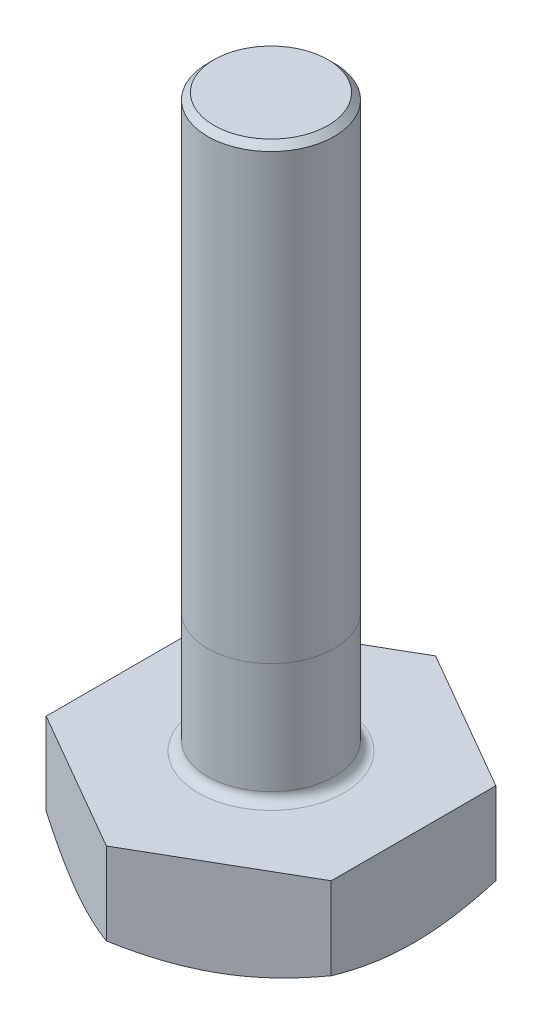
ISO-10303-21;
HEADER;
FILE_DESCRIPTION(('STEP AP214'),'2;1');
FILE_NAME('part.step','',(''),(''),'','','');
FILE_SCHEMA(('AUTOMOTIVE_DESIGN { 1 0 10303 214 1 1 1 1 }'));
ENDSEC;
DATA;
#1=APPLICATION_CONTEXT('core data for automotive mechanical design processes');
#2=APPLICATION_PROTOCOL_DEFINITION('international standard','automotive_design',2000,#1);
#3=PRODUCT_CONTEXT('',#1,'mechanical');
#4=PRODUCT('Part','Part','',(#3));
#5=PRODUCT_RELATED_PRODUCT_CATEGORY('part','',(#4));
#6=PRODUCT_DEFINITION_FORMATION('','',#4);
#7=PRODUCT_DEFINITION_CONTEXT('part definition',#1,'design');
#8=PRODUCT_DEFINITION('design','',#6,#7);
#9=PRODUCT_DEFINITION_SHAPE('','',#8);
#10=(LENGTH_UNIT() NAMED_UNIT(*) SI_UNIT(.MILLI.,.METRE.));
#11=(NAMED_UNIT(*) PLANE_ANGLE_UNIT() SI_UNIT($,.RADIAN.));
#12=(NAMED_UNIT(*) SI_UNIT($,.STERADIAN.) SOLID_ANGLE_UNIT());
#13=UNCERTAINTY_MEASURE_WITH_UNIT(LENGTH_MEASURE(1.E-05),#10,'distance_accuracy_value','');
#14=(GEOMETRIC_REPRESENTATION_CONTEXT(3) GLOBAL_UNCERTAINTY_ASSIGNED_CONTEXT((#13)) GLOBAL_UNIT_ASSIGNED_CONTEXT((#10,
#11,#12)) REPRESENTATION_CONTEXT('',''));
#15=CARTESIAN_POINT('',(0.,0.,0.));
#16=DIRECTION('',(0.,0.,1.));
#17=DIRECTION('',(1.,0.,0.));
#18=AXIS2_PLACEMENT_3D('',#15,#16,#17);
#19=CARTESIAN_POINT('',(0.,10.5,0.));
#20=DIRECTION('',(0.,-1.,0.));
#21=DIRECTION('',(0.,0.,-1.));
#22=AXIS2_PLACEMENT_3D('',#19,#20,#21);
#23=CYLINDRICAL_SURFACE('',#22,1.);
#24=CARTESIAN_POINT('',(0.,1.65,0.));
#25=DIRECTION('',(0.,1.,0.));
#26=DIRECTION('',(0.,0.,1.));
#27=AXIS2_PLACEMENT_3D('',#24,#25,#26);
#28=CIRCLE('',#27,1.);
#29=CARTESIAN_POINT('',(0.,1.65,1.));
#30=VERTEX_POINT('',#29);
#31=EDGE_CURVE('E242',#30,#30,#28,.T.);
#32=ORIENTED_EDGE('',*,*,#31,.T.);
#33=EDGE_LOOP('',(#32));
#34=FACE_BOUND('',#33,.T.);
#35=CARTESIAN_POINT('',(0.,3.4,0.));
#36=DIRECTION('',(0.,1.,0.));
#37=DIRECTION('',(0.,0.,1.));
#38=AXIS2_PLACEMENT_3D('',#35,#36,#37);
#39=CIRCLE('',#38,1.);
#40=CARTESIAN_POINT('',(0.,3.4,1.));
#41=VERTEX_POINT('',#40);
#42=EDGE_CURVE('E12',#41,#41,#39,.T.);
#43=ORIENTED_EDGE('',*,*,#42,.F.);
#44=EDGE_LOOP('',(#43));
#45=FACE_BOUND('',#44,.T.);
#46=ADVANCED_FACE('F43',(#34,#45),#23,.T.);
#47=CARTESIAN_POINT('',(-2.25,1.5,1.29903810567666));
#48=DIRECTION('',(0.5,0.,-0.866025403784439));
#49=DIRECTION('',(-0.866025403784439,0.,-0.5));
#50=AXIS2_PLACEMENT_3D('',#47,#48,#49);
#51=PLANE('',#50);
#52=DIRECTION('',(0.,-1.,0.));
#53=VECTOR('',#52,1.);
#54=CARTESIAN_POINT('',(-2.25,1.5,1.29903810567666));
#55=LINE('',#54,#53);
#56=CARTESIAN_POINT('',(-2.25,1.5,1.29903810567666));
#57=VERTEX_POINT('',#56);
#58=CARTESIAN_POINT('',(-2.25,0.200961894323341,1.29903810567666));
#59=VERTEX_POINT('',#58);
#60=EDGE_CURVE('E449',#57,#59,#55,.T.);
#61=ORIENTED_EDGE('',*,*,#60,.T.);
#62=CARTESIAN_POINT('',(-2.2502,0.201028565434255,1.29892263562282));
#63=CARTESIAN_POINT('',(-2.15132275118564,0.168055578047864,1.35600944184252));
#64=CARTESIAN_POINT('',(-2.05159200282091,0.138067535415598,1.41358901625738));
#65=CARTESIAN_POINT('',(-1.85040345977937,0.0857223882308779,1.52974527574028));
#66=CARTESIAN_POINT('',(-1.74894208949705,0.0633838027064785,1.58832402518513));
#67=CARTESIAN_POINT('',(-1.54727681019892,0.0286095576734186,1.7047555284741));
#68=CARTESIAN_POINT('',(-1.44710393502333,0.0159424738337181,1.76259036492223));
#69=CARTESIAN_POINT('',(-1.24628668739732,0.000818907417418712,1.87853225689702));
#70=CARTESIAN_POINT('',(-1.1456430451668,-0.00165009697600165,1.93663889083104));
#71=CARTESIAN_POINT('',(-0.957574835473435,0.00347837463602921,2.04522012232352));
#72=CARTESIAN_POINT('',(-0.870122156108742,0.00981663451512028,2.09571095029608));
#73=CARTESIAN_POINT('',(-0.695786567891226,0.029907657189889,2.19636364908279));
#74=CARTESIAN_POINT('',(-0.608904262311712,0.0436672872310835,2.24652517159694));
#75=CARTESIAN_POINT('',(-0.434209045898264,0.0780662653506653,2.34738550181938));
#76=CARTESIAN_POINT('',(-0.346418252564747,0.0988514715826553,2.39807153998286));
#77=CARTESIAN_POINT('',(-0.172146263122405,0.146026087362979,2.49868751999961));
#78=CARTESIAN_POINT('',(-0.0856628332489982,0.172404408014302,2.54861875151746));
#79=CARTESIAN_POINT('',(0.000199999999999285,0.201028565434254,2.59819168140715));
#80=B_SPLINE_CURVE_WITH_KNOTS('',3,(#62,#63,#64,#65,#66,#67,#68,#69,#70,#71,#72,#73,#74,#75,#76,
#77,#78,#79),.UNSPECIFIED.,.F.,.F.,(4,2,2,2,2,2,2,2,4),(0.,0.356658826016553,0.714175103224236,
1.06284241804968,1.41108149062516,1.71433394539794,2.01786749258222,2.32813511279245,
2.63779325460359),.UNSPECIFIED.);
#81=CARTESIAN_POINT('',(-1.125,0.,1.94855715851499));
#82=VERTEX_POINT('',#81);
#83=EDGE_CURVE('E63',#59,#82,#80,.T.);
#84=ORIENTED_EDGE('',*,*,#83,.T.);
#85=CARTESIAN_POINT('',(0.,0.200961894323341,2.59807621135332));
#86=VERTEX_POINT('',#85);
#87=EDGE_CURVE('E133',#82,#86,#80,.T.);
#88=ORIENTED_EDGE('',*,*,#87,.T.);
#89=DIRECTION('',(0.,-1.,0.));
#90=VECTOR('',#89,1.);
#91=CARTESIAN_POINT('',(0.,1.5,2.59807621135332));
#92=LINE('',#91,#90);
#93=CARTESIAN_POINT('',(0.,1.5,2.59807621135332));
#94=VERTEX_POINT('',#93);
#95=EDGE_CURVE('E136',#94,#86,#92,.T.);
#96=ORIENTED_EDGE('',*,*,#95,.F.);
#97=DIRECTION('',(0.866025403784439,0.,0.5));
#98=VECTOR('',#97,1.);
#99=CARTESIAN_POINT('',(-2.25,1.5,1.29903810567666));
#100=LINE('',#99,#98);
#101=EDGE_CURVE('E460',#57,#94,#100,.T.);
#102=ORIENTED_EDGE('',*,*,#101,.F.);
#103=EDGE_LOOP('',(#61,#84,#88,#96,#102));
#104=FACE_BOUND('',#103,.T.);
#105=ADVANCED_FACE('F218',(#104),#51,.F.);
#106=CARTESIAN_POINT('',(0.,1.5,2.59807621135332));
#107=DIRECTION('',(-0.5,0.,-0.866025403784439));
#108=DIRECTION('',(-0.866025403784439,0.,0.5));
#109=AXIS2_PLACEMENT_3D('',#106,#107,#108);
#110=PLANE('',#109);
#111=ORIENTED_EDGE('',*,*,#95,.T.);
#112=CARTESIAN_POINT('',(-0.00020000000000049,0.201028565434254,2.59819168140715));
#113=CARTESIAN_POINT('',(0.0986772488143569,0.168055578047863,2.54110487518746));
#114=CARTESIAN_POINT('',(0.198407997179093,0.138067535415598,2.48352530077259));
#115=CARTESIAN_POINT('',(0.399596540220632,0.0857223882308777,2.36736904128969));
#116=CARTESIAN_POINT('',(0.501057910502945,0.0633838027064785,2.30879029184485));
#117=CARTESIAN_POINT('',(0.702723189801078,0.0286095576734188,2.19235878855587));
#118=CARTESIAN_POINT('',(0.802896064976671,0.0159424738337182,2.13452395210774));
#119=CARTESIAN_POINT('',(1.00371331260268,0.000818907417418669,2.01858206013295));
#120=CARTESIAN_POINT('',(1.1043569548332,-0.00165009697600181,1.96047542619893));
#121=CARTESIAN_POINT('',(1.29242516452656,0.00347837463602899,1.85189419470646));
#122=CARTESIAN_POINT('',(1.37987784389126,0.00981663451512008,1.8014033667339));
#123=CARTESIAN_POINT('',(1.55421343210877,0.0299076571898889,1.70075066794718));
#124=CARTESIAN_POINT('',(1.64109573768829,0.0436672872310834,1.65058914543304));
#125=CARTESIAN_POINT('',(1.81579095410174,0.0780662653506653,1.54972881521059));
#126=CARTESIAN_POINT('',(1.90358174743525,0.0988514715826553,1.49904277704711));
#127=CARTESIAN_POINT('',(2.07785373687759,0.146026087362979,1.39842679703037));
#128=CARTESIAN_POINT('',(2.164337166751,0.172404408014302,1.34849556551251));
#129=CARTESIAN_POINT('',(2.2502,0.201028565434254,1.29892263562282));
#130=B_SPLINE_CURVE_WITH_KNOTS('',3,(#112,#113,#114,#115,#116,#117,#118,#119,#120,#121,#122,
#123,#124,#125,#126,#127,#128,#129),.UNSPECIFIED.,.F.,.F.,(4,2,2,2,2,2,2,2,4),(0.,
0.356658826016552,0.714175103224236,1.06284241804968,1.41108149062516,1.71433394539794,
2.01786749258222,2.32813511279245,2.63779325460359),.UNSPECIFIED.);
#131=CARTESIAN_POINT('',(1.125,0.,1.94855715851499));
#132=VERTEX_POINT('',#131);
#133=EDGE_CURVE('E126',#86,#132,#130,.T.);
#134=ORIENTED_EDGE('',*,*,#133,.T.);
#135=CARTESIAN_POINT('',(2.25,0.200961894323341,1.29903810567666));
#136=VERTEX_POINT('',#135);
#137=EDGE_CURVE('E114',#132,#136,#130,.T.);
#138=ORIENTED_EDGE('',*,*,#137,.T.);
#139=DIRECTION('',(0.,-1.,0.));
#140=VECTOR('',#139,1.);
#141=CARTESIAN_POINT('',(2.25,1.5,1.29903810567666));
#142=LINE('',#141,#140);
#143=CARTESIAN_POINT('',(2.25,1.5,1.29903810567666));
#144=VERTEX_POINT('',#143);
#145=EDGE_CURVE('E446',#144,#136,#142,.T.);
#146=ORIENTED_EDGE('',*,*,#145,.F.);
#147=DIRECTION('',(0.866025403784439,0.,-0.5));
#148=VECTOR('',#147,1.);
#149=CARTESIAN_POINT('',(0.,1.5,2.59807621135332));
#150=LINE('',#149,#148);
#151=EDGE_CURVE('E458',#94,#144,#150,.T.);
#152=ORIENTED_EDGE('',*,*,#151,.F.);
#153=EDGE_LOOP('',(#111,#134,#138,#146,#152));
#154=FACE_BOUND('',#153,.T.);
#155=ADVANCED_FACE('F144',(#154),#110,.F.);
#156=CARTESIAN_POINT('',(2.25,1.5,1.29903810567666));
#157=DIRECTION('',(-1.,0.,0.));
#158=DIRECTION('',(0.,0.,1.));
#159=AXIS2_PLACEMENT_3D('',#156,#157,#158);
#160=PLANE('',#159);
#161=ORIENTED_EDGE('',*,*,#145,.T.);
#162=CARTESIAN_POINT('',(2.25,1.50250600958681,4.29923810567666));
#163=CARTESIAN_POINT('',(2.25,1.45100673959601,4.19854763429779));
#164=CARTESIAN_POINT('',(2.25,1.39980440735512,4.09770389799694));
#165=CARTESIAN_POINT('',(2.25,1.2981417013294,3.89564066138717));
#166=CARTESIAN_POINT('',(2.25,1.24768134334197,3.79442115313498));
#167=CARTESIAN_POINT('',(2.25,1.14756717394514,3.59136760120248));
#168=CARTESIAN_POINT('',(2.25,1.09791489266805,3.48953280171572));
#169=CARTESIAN_POINT('',(2.25,0.999708894038865,3.28533217225698));
#170=CARTESIAN_POINT('',(2.25,0.951155192734001,3.18296633455481));
#171=CARTESIAN_POINT('',(2.25,0.852969246076487,2.97236643961527));
#172=CARTESIAN_POINT('',(2.25,0.803408097726376,2.86409913793486));
#173=CARTESIAN_POINT('',(2.25,0.706193188908661,2.64671235244652));
#174=CARTESIAN_POINT('',(2.25,0.658539373706709,2.53759289320033));
#175=CARTESIAN_POINT('',(2.25,0.565711561085179,2.3183884115824));
#176=CARTESIAN_POINT('',(2.25,0.520535851945818,2.20830411820158));
#177=CARTESIAN_POINT('',(2.25,0.433351062791473,1.98685096205848));
#178=CARTESIAN_POINT('',(2.25,0.391342757642543,1.87548179260092));
#179=CARTESIAN_POINT('',(2.25,0.30435587736438,1.63124207582556));
#180=CARTESIAN_POINT('',(2.25,0.260184093647921,1.49807973682795));
#181=CARTESIAN_POINT('',(2.25,0.179785794416141,1.22940487880168));
#182=CARTESIAN_POINT('',(2.25,0.14355508696828,1.09389364067574));
#183=CARTESIAN_POINT('',(2.25,0.0823278008316329,0.822937605381817));
#184=CARTESIAN_POINT('',(2.25,0.0571345851114454,0.687538562947851));
#185=CARTESIAN_POINT('',(2.25,0.0197048456101012,0.414968196629746));
#186=CARTESIAN_POINT('',(2.25,0.00746103285892581,0.277797913805434));
#187=CARTESIAN_POINT('',(2.25,-0.0024687791597787,0.00130435900793844));
#188=CARTESIAN_POINT('',(2.25,1.64630354959535E-05,-0.138025379517811));
#189=CARTESIAN_POINT('',(2.25,0.0195762310371541,-0.415663651785115));
#190=CARTESIAN_POINT('',(2.25,0.0366565203467547,-0.553971760324691));
#191=CARTESIAN_POINT('',(2.25,0.0836272334393119,-0.831110115834419));
#192=CARTESIAN_POINT('',(2.25,0.113762543342828,-0.969897315204753));
#193=CARTESIAN_POINT('',(2.25,0.183873280715538,-1.24492651405697));
#194=CARTESIAN_POINT('',(2.25,0.22385097256321,-1.38116792007203));
#195=CARTESIAN_POINT('',(2.25,0.307486157448212,-1.64038242786214));
#196=CARTESIAN_POINT('',(2.25,0.350586189406336,-1.76353888461486));
#197=CARTESIAN_POINT('',(2.25,0.441317284538148,-2.00818310958318));
#198=CARTESIAN_POINT('',(2.25,0.488949243070281,-2.12967054260676));
#199=CARTESIAN_POINT('',(2.25,0.587631391252294,-2.37136364906335));
#200=CARTESIAN_POINT('',(2.25,0.638684564210007,-2.49156809501624));
#201=CARTESIAN_POINT('',(2.25,0.743346508074056,-2.73086064724208));
#202=CARTESIAN_POINT('',(2.25,0.796955402913101,-2.8499486990428));
#203=CARTESIAN_POINT('',(2.25,0.903221328177756,-3.08089865212164));
#204=CARTESIAN_POINT('',(2.25,0.955776842134315,-3.19280744412873));
#205=CARTESIAN_POINT('',(2.25,1.06227398236268,-3.41596599981572));
#206=CARTESIAN_POINT('',(2.25,1.11621564750144,-3.52721574490842));
#207=CARTESIAN_POINT('',(2.25,1.2250460293641,-3.74885299447404));
#208=CARTESIAN_POINT('',(2.25,1.27993157756267,-3.85924205832066));
#209=CARTESIAN_POINT('',(2.25,1.39059685478923,-4.07956041332368));
#210=CARTESIAN_POINT('',(2.25,1.44637651243886,-4.18948974030694));
#211=CARTESIAN_POINT('',(2.25,1.50250600958681,-4.29923810567666));
#212=B_SPLINE_CURVE_WITH_KNOTS('',3,(#162,#163,#164,#165,#166,#167,#168,#169,#170,#171,#172,
#173,#174,#175,#176,#177,#178,#179,#180,#181,#182,#183,#184,#185,#186,#187,#188,#189,#190,#191,
#192,#193,#194,#195,#196,#197,#198,#199,#200,#201,#202,#203,#204,#205,#206,#207,#208,#209,#210,
#211),.UNSPECIFIED.,.F.,.F.,(4,2,2,2,2,2,2,2,2,2,2,2,2,2,2,2,2,2,2,2,2,2,2,2,4),(0.,
0.3392898931421,0.678586999689628,1.01846547762647,1.3583489170525,1.71555013339557,
2.07274109184847,2.42968213538663,2.78671021869218,3.20742342892804,3.62791401546856,
4.04057426331807,4.45300210882358,4.87023421565588,5.28763116131805,5.71322177566461,
6.13891039476872,6.53023977488808,6.92164662989863,7.31339934931275,7.70517108505995,
8.0760651822476,8.44696969048549,8.81680788058681,9.18661669145733),.UNSPECIFIED.);
#213=CARTESIAN_POINT('',(2.25,0.,0.));
#214=VERTEX_POINT('',#213);
#215=EDGE_CURVE('E121',#136,#214,#212,.T.);
#216=ORIENTED_EDGE('',*,*,#215,.T.);
#217=CARTESIAN_POINT('',(2.25,0.200961894323341,-1.29903810567666));
#218=VERTEX_POINT('',#217);
#219=EDGE_CURVE('E154',#214,#218,#212,.T.);
#220=ORIENTED_EDGE('',*,*,#219,.T.);
#221=DIRECTION('',(0.,-1.,0.));
#222=VECTOR('',#221,1.);
#223=CARTESIAN_POINT('',(2.25,1.5,-1.29903810567666));
#224=LINE('',#223,#222);
#225=CARTESIAN_POINT('',(2.25,1.5,-1.29903810567666));
#226=VERTEX_POINT('',#225);
#227=EDGE_CURVE('E442',#226,#218,#224,.T.);
#228=ORIENTED_EDGE('',*,*,#227,.F.);
#229=DIRECTION('',(0.,0.,-1.));
#230=VECTOR('',#229,1.);
#231=CARTESIAN_POINT('',(2.25,1.5,1.29903810567666));
#232=LINE('',#231,#230);
#233=EDGE_CURVE('E457',#144,#226,#232,.T.);
#234=ORIENTED_EDGE('',*,*,#233,.F.);
#235=EDGE_LOOP('',(#161,#216,#220,#228,#234));
#236=FACE_BOUND('',#235,.T.);
#237=ADVANCED_FACE('F209',(#236),#160,.F.);
#238=CARTESIAN_POINT('',(2.25,1.5,-1.29903810567666));
#239=DIRECTION('',(-0.5,0.,0.866025403784439));
#240=DIRECTION('',(0.866025403784439,0.,0.5));
#241=AXIS2_PLACEMENT_3D('',#238,#239,#240);
#242=PLANE('',#241);
#243=ORIENTED_EDGE('',*,*,#227,.T.);
#244=CARTESIAN_POINT('',(2.2502,0.201028565434254,-1.29892263562282));
#245=CARTESIAN_POINT('',(2.15132275118564,0.168055578047863,-1.35600944184252));
#246=CARTESIAN_POINT('',(2.05159200282091,0.138067535415598,-1.41358901625738));
#247=CARTESIAN_POINT('',(1.85040345977937,0.0857223882308776,-1.52974527574028));
#248=CARTESIAN_POINT('',(1.74894208949705,0.0633838027064784,-1.58832402518513));
#249=CARTESIAN_POINT('',(1.54727681019892,0.0286095576734187,-1.7047555284741));
#250=CARTESIAN_POINT('',(1.44710393502333,0.0159424738337182,-1.76259036492223));
#251=CARTESIAN_POINT('',(1.24628668739732,0.000818907417418853,-1.87853225689703));
#252=CARTESIAN_POINT('',(1.1456430451668,-0.00165009697600144,-1.93663889083104));
#253=CARTESIAN_POINT('',(0.957574835473434,0.00347837463602938,-2.04522012232352));
#254=CARTESIAN_POINT('',(0.870122156108741,0.00981663451512036,-2.09571095029608));
#255=CARTESIAN_POINT('',(0.695786567891225,0.0299076571898891,-2.19636364908279));
#256=CARTESIAN_POINT('',(0.608904262311711,0.0436672872310837,-2.24652517159694));
#257=CARTESIAN_POINT('',(0.434209045898263,0.0780662653506656,-2.34738550181938));
#258=CARTESIAN_POINT('',(0.346418252564746,0.0988514715826556,-2.39807153998286));
#259=CARTESIAN_POINT('',(0.172146263122404,0.146026087362979,-2.49868751999961));
#260=CARTESIAN_POINT('',(0.0856628332489966,0.172404408014302,-2.54861875151746));
#261=CARTESIAN_POINT('',(-0.00020000000000088,0.201028565434255,-2.59819168140715));
#262=B_SPLINE_CURVE_WITH_KNOTS('',3,(#244,#245,#246,#247,#248,#249,#250,#251,#252,#253,#254,
#255,#256,#257,#258,#259,#260,#261),.UNSPECIFIED.,.F.,.F.,(4,2,2,2,2,2,2,2,4),(0.,
0.356658826016552,0.714175103224236,1.06284241804968,1.41108149062516,1.71433394539794,
2.01786749258222,2.32813511279245,2.63779325460359),.UNSPECIFIED.);
#263=CARTESIAN_POINT('',(1.125,0.,-1.94855715851499));
#264=VERTEX_POINT('',#263);
#265=EDGE_CURVE('E203',#218,#264,#262,.T.);
#266=ORIENTED_EDGE('',*,*,#265,.T.);
#267=CARTESIAN_POINT('',(0.,0.200961894323341,-2.59807621135332));
#268=VERTEX_POINT('',#267);
#269=EDGE_CURVE('E196',#264,#268,#262,.T.);
#270=ORIENTED_EDGE('',*,*,#269,.T.);
#271=DIRECTION('',(0.,-1.,0.));
#272=VECTOR('',#271,1.);
#273=CARTESIAN_POINT('',(0.,1.5,-2.59807621135332));
#274=LINE('',#273,#272);
#275=CARTESIAN_POINT('',(0.,1.5,-2.59807621135332));
#276=VERTEX_POINT('',#275);
#277=EDGE_CURVE('E437',#276,#268,#274,.T.);
#278=ORIENTED_EDGE('',*,*,#277,.F.);
#279=DIRECTION('',(-0.866025403784439,0.,-0.5));
#280=VECTOR('',#279,1.);
#281=CARTESIAN_POINT('',(2.25,1.5,-1.29903810567666));
#282=LINE('',#281,#280);
#283=EDGE_CURVE('E470',#226,#276,#282,.T.);
#284=ORIENTED_EDGE('',*,*,#283,.F.);
#285=EDGE_LOOP('',(#243,#266,#270,#278,#284));
#286=FACE_BOUND('',#285,.T.);
#287=ADVANCED_FACE('F205',(#286),#242,.F.);
#288=CARTESIAN_POINT('',(0.,1.5,-2.59807621135332));
#289=DIRECTION('',(0.5,0.,0.866025403784439));
#290=DIRECTION('',(0.866025403784439,0.,-0.5));
#291=AXIS2_PLACEMENT_3D('',#288,#289,#290);
#292=PLANE('',#291);
#293=ORIENTED_EDGE('',*,*,#277,.T.);
#294=CARTESIAN_POINT('',(0.000199999999999129,0.201028565434255,-2.59819168140715));
#295=CARTESIAN_POINT('',(-0.0986772488143582,0.168055578047864,-2.54110487518746));
#296=CARTESIAN_POINT('',(-0.198407997179094,0.138067535415598,-2.48352530077259));
#297=CARTESIAN_POINT('',(-0.399596540220634,0.085722388230878,-2.36736904128969));
#298=CARTESIAN_POINT('',(-0.501057910502946,0.0633838027064786,-2.30879029184485));
#299=CARTESIAN_POINT('',(-0.70272318980108,0.0286095576734188,-2.19235878855587));
#300=CARTESIAN_POINT('',(-0.802896064976673,0.0159424738337184,-2.13452395210774));
#301=CARTESIAN_POINT('',(-1.00371331260268,0.000818907417418925,-2.01858206013295));
#302=CARTESIAN_POINT('',(-1.1043569548332,-0.00165009697600151,-1.96047542619893));
#303=CARTESIAN_POINT('',(-1.29242516452657,0.00347837463602932,-1.85189419470646));
#304=CARTESIAN_POINT('',(-1.37987784389126,0.0098166345151204,-1.8014033667339));
#305=CARTESIAN_POINT('',(-1.55421343210877,0.0299076571898891,-1.70075066794718));
#306=CARTESIAN_POINT('',(-1.64109573768829,0.0436672872310835,-1.65058914543304));
#307=CARTESIAN_POINT('',(-1.81579095410174,0.0780662653506653,-1.54972881521059));
#308=CARTESIAN_POINT('',(-1.90358174743525,0.0988514715826554,-1.49904277704711));
#309=CARTESIAN_POINT('',(-2.0778537368776,0.146026087362979,-1.39842679703037));
#310=CARTESIAN_POINT('',(-2.164337166751,0.172404408014302,-1.34849556551251));
#311=CARTESIAN_POINT('',(-2.2502,0.201028565434254,-1.29892263562282));
#312=B_SPLINE_CURVE_WITH_KNOTS('',3,(#294,#295,#296,#297,#298,#299,#300,#301,#302,#303,#304,
#305,#306,#307,#308,#309,#310,#311),.UNSPECIFIED.,.F.,.F.,(4,2,2,2,2,2,2,2,4),(0.,
0.356658826016552,0.714175103224236,1.06284241804968,1.41108149062516,1.71433394539794,
2.01786749258222,2.32813511279245,2.63779325460359),.UNSPECIFIED.);
#313=CARTESIAN_POINT('',(-1.125,0.,-1.94855715851499));
#314=VERTEX_POINT('',#313);
#315=EDGE_CURVE('E204',#268,#314,#312,.T.);
#316=ORIENTED_EDGE('',*,*,#315,.T.);
#317=CARTESIAN_POINT('',(-2.25,0.200961894323341,-1.29903810567666));
#318=VERTEX_POINT('',#317);
#319=EDGE_CURVE('E190',#314,#318,#312,.T.);
#320=ORIENTED_EDGE('',*,*,#319,.T.);
#321=DIRECTION('',(0.,-1.,0.));
#322=VECTOR('',#321,1.);
#323=CARTESIAN_POINT('',(-2.25,1.5,-1.29903810567666));
#324=LINE('',#323,#322);
#325=CARTESIAN_POINT('',(-2.25,1.5,-1.29903810567666));
#326=VERTEX_POINT('',#325);
#327=EDGE_CURVE('E443',#326,#318,#324,.T.);
#328=ORIENTED_EDGE('',*,*,#327,.F.);
#329=DIRECTION('',(-0.866025403784438,0.,0.5));
#330=VECTOR('',#329,1.);
#331=CARTESIAN_POINT('',(0.,1.5,-2.59807621135332));
#332=LINE('',#331,#330);
#333=EDGE_CURVE('E440',#276,#326,#332,.T.);
#334=ORIENTED_EDGE('',*,*,#333,.F.);
#335=EDGE_LOOP('',(#293,#316,#320,#328,#334));
#336=FACE_BOUND('',#335,.T.);
#337=ADVANCED_FACE('F208',(#336),#292,.F.);
#338=CARTESIAN_POINT('',(-2.25,1.5,-1.29903810567666));
#339=DIRECTION('',(1.,0.,0.));
#340=DIRECTION('',(0.,0.,-1.));
#341=AXIS2_PLACEMENT_3D('',#338,#339,#340);
#342=PLANE('',#341);
#343=ORIENTED_EDGE('',*,*,#327,.T.);
#344=CARTESIAN_POINT('',(-2.25,1.50250600958681,-4.29923810567666));
#345=CARTESIAN_POINT('',(-2.25,1.45100673959601,-4.19854763429778));
#346=CARTESIAN_POINT('',(-2.25,1.39980440735512,-4.09770389799694));
#347=CARTESIAN_POINT('',(-2.25,1.2981417013294,-3.89564066138717));
#348=CARTESIAN_POINT('',(-2.25,1.24768134334197,-3.79442115313498));
#349=CARTESIAN_POINT('',(-2.25,1.14756717394514,-3.59136760120248));
#350=CARTESIAN_POINT('',(-2.25,1.09791489266805,-3.48953280171572));
#351=CARTESIAN_POINT('',(-2.25,0.999708894038864,-3.28533217225698));
#352=CARTESIAN_POINT('',(-2.25,0.951155192734,-3.18296633455481));
#353=CARTESIAN_POINT('',(-2.25,0.852969246076486,-2.97236643961527));
#354=CARTESIAN_POINT('',(-2.25,0.803408097726375,-2.86409913793486));
#355=CARTESIAN_POINT('',(-2.25,0.70619318890866,-2.64671235244652));
#356=CARTESIAN_POINT('',(-2.25,0.658539373706709,-2.53759289320033));
#357=CARTESIAN_POINT('',(-2.25,0.565711561085179,-2.3183884115824));
#358=CARTESIAN_POINT('',(-2.25,0.520535851945817,-2.20830411820158));
#359=CARTESIAN_POINT('',(-2.25,0.433351062791473,-1.98685096205848));
#360=CARTESIAN_POINT('',(-2.25,0.391342757642543,-1.87548179260092));
#361=CARTESIAN_POINT('',(-2.25,0.30435587736438,-1.63124207582556));
#362=CARTESIAN_POINT('',(-2.25,0.260184093647921,-1.49807973682795));
#363=CARTESIAN_POINT('',(-2.25,0.179785794416141,-1.22940487880168));
#364=CARTESIAN_POINT('',(-2.25,0.14355508696828,-1.09389364067574));
#365=CARTESIAN_POINT('',(-2.25,0.0823278008316332,-0.822937605381817));
#366=CARTESIAN_POINT('',(-2.25,0.0571345851114459,-0.68753856294785));
#367=CARTESIAN_POINT('',(-2.25,0.0197048456101019,-0.414968196629746));
#368=CARTESIAN_POINT('',(-2.25,0.00746103285892642,-0.277797913805433));
#369=CARTESIAN_POINT('',(-2.25,-0.00246877915977808,-0.00130435900793827));
#370=CARTESIAN_POINT('',(-2.25,1.64630354965972E-05,0.138025379517811));
#371=CARTESIAN_POINT('',(-2.25,0.0195762310371548,0.415663651785114));
#372=CARTESIAN_POINT('',(-2.25,0.0366565203467554,0.55397176032469));
#373=CARTESIAN_POINT('',(-2.25,0.0836272334393126,0.831110115834418));
#374=CARTESIAN_POINT('',(-2.25,0.113762543342829,0.969897315204752));
#375=CARTESIAN_POINT('',(-2.25,0.183873280715538,1.24492651405697));
#376=CARTESIAN_POINT('',(-2.25,0.223850972563211,1.38116792007203));
#377=CARTESIAN_POINT('',(-2.25,0.307486157448212,1.64038242786214));
#378=CARTESIAN_POINT('',(-2.25,0.350586189406337,1.76353888461486));
#379=CARTESIAN_POINT('',(-2.25,0.441317284538148,2.00818310958318));
#380=CARTESIAN_POINT('',(-2.25,0.488949243070281,2.12967054260676));
#381=CARTESIAN_POINT('',(-2.25,0.587631391252295,2.37136364906335));
#382=CARTESIAN_POINT('',(-2.25,0.638684564210007,2.49156809501624));
#383=CARTESIAN_POINT('',(-2.25,0.743346508074056,2.73086064724208));
#384=CARTESIAN_POINT('',(-2.25,0.796955402913101,2.8499486990428));
#385=CARTESIAN_POINT('',(-2.25,0.903221328177756,3.08089865212164));
#386=CARTESIAN_POINT('',(-2.25,0.955776842134315,3.19280744412873));
#387=CARTESIAN_POINT('',(-2.25,1.06227398236268,3.41596599981571));
#388=CARTESIAN_POINT('',(-2.25,1.11621564750144,3.52721574490842));
#389=CARTESIAN_POINT('',(-2.25,1.2250460293641,3.74885299447403));
#390=CARTESIAN_POINT('',(-2.25,1.27993157756267,3.85924205832065));
#391=CARTESIAN_POINT('',(-2.25,1.39059685478923,4.07956041332368));
#392=CARTESIAN_POINT('',(-2.25,1.44637651243886,4.18948974030694));
#393=CARTESIAN_POINT('',(-2.25,1.50250600958681,4.29923810567666));
#394=B_SPLINE_CURVE_WITH_KNOTS('',3,(#344,#345,#346,#347,#348,#349,#350,#351,#352,#353,#354,
#355,#356,#357,#358,#359,#360,#361,#362,#363,#364,#365,#366,#367,#368,#369,#370,#371,#372,#373,
#374,#375,#376,#377,#378,#379,#380,#381,#382,#383,#384,#385,#386,#387,#388,#389,#390,#391,#392,
#393),.UNSPECIFIED.,.F.,.F.,(4,2,2,2,2,2,2,2,2,2,2,2,2,2,2,2,2,2,2,2,2,2,2,2,4),(0.,
0.3392898931421,0.678586999689628,1.01846547762647,1.3583489170525,1.71555013339557,
2.07274109184847,2.42968213538663,2.78671021869218,3.20742342892804,3.62791401546855,
4.04057426331806,4.45300210882357,4.87023421565588,5.28763116131805,5.71322177566461,
6.13891039476872,6.53023977488807,6.92164662989863,7.31339934931274,7.70517108505994,
8.07606518224759,8.44696969048548,8.81680788058681,9.18661669145733),.UNSPECIFIED.);
#395=CARTESIAN_POINT('',(-2.25,0.,0.));
#396=VERTEX_POINT('',#395);
#397=EDGE_CURVE('E479',#318,#396,#394,.T.);
#398=ORIENTED_EDGE('',*,*,#397,.T.);
#399=EDGE_CURVE('E141',#396,#59,#394,.T.);
#400=ORIENTED_EDGE('',*,*,#399,.T.);
#401=ORIENTED_EDGE('',*,*,#60,.F.);
#402=DIRECTION('',(0.,0.,1.));
#403=VECTOR('',#402,1.);
#404=CARTESIAN_POINT('',(-2.25,1.5,-1.29903810567666));
#405=LINE('',#404,#403);
#406=EDGE_CURVE('E464',#326,#57,#405,.T.);
#407=ORIENTED_EDGE('',*,*,#406,.F.);
#408=EDGE_LOOP('',(#343,#398,#400,#401,#407));
#409=FACE_BOUND('',#408,.T.);
#410=ADVANCED_FACE('F339',(#409),#342,.F.);
#411=CARTESIAN_POINT('',(0.,1.5,0.));
#412=DIRECTION('',(0.,1.,0.));
#413=DIRECTION('',(0.,0.,1.));
#414=AXIS2_PLACEMENT_3D('',#411,#412,#413);
#415=PLANE('',#414);
#416=CARTESIAN_POINT('',(0.,1.5,0.));
#417=DIRECTION('',(0.,1.,0.));
#418=DIRECTION('',(0.,0.,1.));
#419=AXIS2_PLACEMENT_3D('',#416,#417,#418);
#420=CIRCLE('',#419,1.15);
#421=CARTESIAN_POINT('',(0.,1.5,1.15));
#422=VERTEX_POINT('',#421);
#423=EDGE_CURVE('E52',#422,#422,#420,.F.);
#424=ORIENTED_EDGE('',*,*,#423,.T.);
#425=EDGE_LOOP('',(#424));
#426=FACE_BOUND('',#425,.T.);
#427=ORIENTED_EDGE('',*,*,#101,.T.);
#428=ORIENTED_EDGE('',*,*,#151,.T.);
#429=ORIENTED_EDGE('',*,*,#233,.T.);
#430=ORIENTED_EDGE('',*,*,#283,.T.);
#431=ORIENTED_EDGE('',*,*,#333,.T.);
#432=ORIENTED_EDGE('',*,*,#406,.T.);
#433=EDGE_LOOP('',(#427,#428,#429,#430,#431,#432));
#434=FACE_BOUND('',#433,.T.);
#435=ADVANCED_FACE('F176',(#426,#434),#415,.T.);
#436=CARTESIAN_POINT('',(0.,0.,0.));
#437=DIRECTION('',(0.,1.,0.));
#438=DIRECTION('',(0.,0.,1.));
#439=AXIS2_PLACEMENT_3D('',#436,#437,#438);
#440=CONICAL_SURFACE('',#439,2.25,1.0471975511966);
#441=CARTESIAN_POINT('',(0.,0.,0.));
#442=DIRECTION('',(0.,1.,0.));
#443=DIRECTION('',(0.,0.,1.));
#444=AXIS2_PLACEMENT_3D('',#441,#442,#443);
#445=CIRCLE('',#444,2.25);
#446=EDGE_CURVE('E130',#132,#82,#445,.F.);
#447=ORIENTED_EDGE('',*,*,#446,.F.);
#448=ORIENTED_EDGE('',*,*,#133,.F.);
#449=ORIENTED_EDGE('',*,*,#87,.F.);
#450=EDGE_LOOP('',(#447,#448,#449));
#451=FACE_BOUND('',#450,.T.);
#452=ADVANCED_FACE('F131',(#451),#440,.T.);
#453=CARTESIAN_POINT('',(0.,0.,0.));
#454=DIRECTION('',(0.,1.,0.));
#455=DIRECTION('',(0.,0.,1.));
#456=AXIS2_PLACEMENT_3D('',#453,#454,#455);
#457=CIRCLE('',#456,2.25);
#458=EDGE_CURVE('E118',#132,#214,#457,.T.);
#459=ORIENTED_EDGE('',*,*,#458,.T.);
#460=ORIENTED_EDGE('',*,*,#215,.F.);
#461=ORIENTED_EDGE('',*,*,#137,.F.);
#462=EDGE_LOOP('',(#459,#460,#461));
#463=FACE_BOUND('',#462,.T.);
#464=ADVANCED_FACE('F116',(#463),#440,.T.);
#465=EDGE_CURVE('E135',#264,#214,#445,.F.);
#466=ORIENTED_EDGE('',*,*,#465,.F.);
#467=ORIENTED_EDGE('',*,*,#265,.F.);
#468=ORIENTED_EDGE('',*,*,#219,.F.);
#469=EDGE_LOOP('',(#466,#467,#468));
#470=FACE_BOUND('',#469,.T.);
#471=ADVANCED_FACE('F308',(#470),#440,.T.);
#472=EDGE_CURVE('E473',#314,#264,#445,.F.);
#473=ORIENTED_EDGE('',*,*,#472,.F.);
#474=ORIENTED_EDGE('',*,*,#315,.F.);
#475=ORIENTED_EDGE('',*,*,#269,.F.);
#476=EDGE_LOOP('',(#473,#474,#475));
#477=FACE_BOUND('',#476,.T.);
#478=ADVANCED_FACE('F298',(#477),#440,.T.);
#479=EDGE_CURVE('E477',#396,#314,#445,.F.);
#480=ORIENTED_EDGE('',*,*,#479,.F.);
#481=ORIENTED_EDGE('',*,*,#397,.F.);
#482=ORIENTED_EDGE('',*,*,#319,.F.);
#483=EDGE_LOOP('',(#480,#481,#482));
#484=FACE_BOUND('',#483,.T.);
#485=ADVANCED_FACE('F173',(#484),#440,.T.);
#486=ORIENTED_EDGE('',*,*,#399,.F.);
#487=EDGE_CURVE('E59',#82,#396,#445,.F.);
#488=ORIENTED_EDGE('',*,*,#487,.F.);
#489=ORIENTED_EDGE('',*,*,#83,.F.);
#490=EDGE_LOOP('',(#486,#488,#489));
#491=FACE_BOUND('',#490,.T.);
#492=ADVANCED_FACE('F168',(#491),#440,.T.);
#493=CARTESIAN_POINT('',(0.,0.,0.));
#494=DIRECTION('',(0.,1.,0.));
#495=DIRECTION('',(0.,0.,1.));
#496=AXIS2_PLACEMENT_3D('',#493,#494,#495);
#497=PLANE('',#496);
#498=ORIENTED_EDGE('',*,*,#446,.T.);
#499=ORIENTED_EDGE('',*,*,#487,.T.);
#500=ORIENTED_EDGE('',*,*,#479,.T.);
#501=ORIENTED_EDGE('',*,*,#472,.T.);
#502=ORIENTED_EDGE('',*,*,#465,.T.);
#503=ORIENTED_EDGE('',*,*,#458,.F.);
#504=EDGE_LOOP('',(#498,#499,#500,#501,#502,#503));
#505=FACE_BOUND('',#504,.T.);
#506=ADVANCED_FACE('F138',(#505),#497,.F.);
#507=ORIENTED_EDGE('',*,*,#42,.T.);
#508=EDGE_LOOP('',(#507));
#509=FACE_BOUND('',#508,.T.);
#510=CARTESIAN_POINT('',(0.,10.4,0.));
#511=DIRECTION('',(0.,1.,0.));
#512=DIRECTION('',(0.,0.,1.));
#513=AXIS2_PLACEMENT_3D('',#510,#511,#512);
#514=CIRCLE('',#513,1.);
#515=CARTESIAN_POINT('',(0.,10.4,1.));
#516=VERTEX_POINT('',#515);
#517=EDGE_CURVE('E240',#516,#516,#514,.F.);
#518=ORIENTED_EDGE('',*,*,#517,.T.);
#519=EDGE_LOOP('',(#518));
#520=FACE_BOUND('',#519,.T.);
#521=ADVANCED_FACE('F174',(#509,#520),#23,.T.);
#522=CARTESIAN_POINT('',(0.,10.5,0.));
#523=DIRECTION('',(0.,1.,0.));
#524=DIRECTION('',(0.,0.,1.));
#525=AXIS2_PLACEMENT_3D('',#522,#523,#524);
#526=PLANE('',#525);
#527=CARTESIAN_POINT('',(0.,10.5,0.));
#528=DIRECTION('',(0.,1.,0.));
#529=DIRECTION('',(0.,0.,1.));
#530=AXIS2_PLACEMENT_3D('',#527,#528,#529);
#531=CIRCLE('',#530,0.900000000000001);
#532=CARTESIAN_POINT('',(0.,10.5,0.900000000000001));
#533=VERTEX_POINT('',#532);
#534=EDGE_CURVE('E243',#533,#533,#531,.T.);
#535=ORIENTED_EDGE('',*,*,#534,.T.);
#536=EDGE_LOOP('',(#535));
#537=FACE_BOUND('',#536,.T.);
#538=ADVANCED_FACE('F228',(#537),#526,.T.);
#539=CARTESIAN_POINT('',(0.,10.5,0.));
#540=DIRECTION('',(0.,-1.,0.));
#541=DIRECTION('',(0.,0.,-1.));
#542=AXIS2_PLACEMENT_3D('',#539,#540,#541);
#543=CONICAL_SURFACE('',#542,0.900000000000001,0.785398163397444);
#544=ORIENTED_EDGE('',*,*,#517,.F.);
#545=EDGE_LOOP('',(#544));
#546=FACE_BOUND('',#545,.T.);
#547=ORIENTED_EDGE('',*,*,#534,.F.);
#548=EDGE_LOOP('',(#547));
#549=FACE_BOUND('',#548,.T.);
#550=ADVANCED_FACE('F234',(#546,#549),#543,.T.);
#551=CARTESIAN_POINT('',(0.,1.65,0.));
#552=DIRECTION('',(0.,1.,0.));
#553=DIRECTION('',(0.,0.,1.));
#554=AXIS2_PLACEMENT_3D('',#551,#552,#553);
#555=TOROIDAL_SURFACE('',#554,1.15,0.15);
#556=ORIENTED_EDGE('',*,*,#423,.F.);
#557=EDGE_LOOP('',(#556));
#558=FACE_BOUND('',#557,.T.);
#559=ORIENTED_EDGE('',*,*,#31,.F.);
#560=EDGE_LOOP('',(#559));
#561=FACE_BOUND('',#560,.T.);
#562=ADVANCED_FACE('F45',(#558,#561),#555,.F.);
#563=CLOSED_SHELL('',(#46,#105,#155,#237,#287,#337,#410,#435,#452,#464,#471,#478,#485,#492,#506,
#521,#538,#550,#562));
#564=MANIFOLD_SOLID_BREP('B2',#563);
#565=ADVANCED_BREP_SHAPE_REPRESENTATION('',(#18,#564),#14);
#566=SHAPE_DEFINITION_REPRESENTATION(#9,#565);
ENDSEC;
END-ISO-10303-21;
